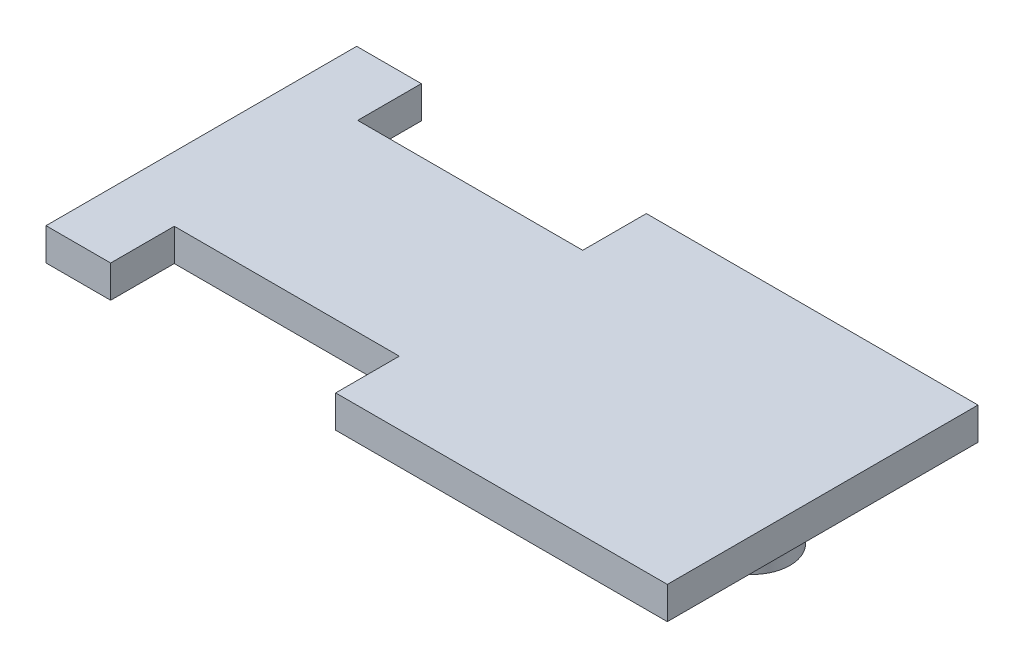
ISO-10303-21;
HEADER;
FILE_DESCRIPTION(('STEP AP214'),'2;1');
FILE_NAME('part.step','',(''),(''),'','','');
FILE_SCHEMA(('AUTOMOTIVE_DESIGN { 1 0 10303 214 1 1 1 1 }'));
ENDSEC;
DATA;
#1=APPLICATION_CONTEXT('core data for automotive mechanical design processes');
#2=APPLICATION_PROTOCOL_DEFINITION('international standard','automotive_design',2000,#1);
#3=PRODUCT_CONTEXT('',#1,'mechanical');
#4=PRODUCT('Part','Part','',(#3));
#5=PRODUCT_RELATED_PRODUCT_CATEGORY('part','',(#4));
#6=PRODUCT_DEFINITION_FORMATION('','',#4);
#7=PRODUCT_DEFINITION_CONTEXT('part definition',#1,'design');
#8=PRODUCT_DEFINITION('design','',#6,#7);
#9=PRODUCT_DEFINITION_SHAPE('','',#8);
#10=(LENGTH_UNIT() NAMED_UNIT(*) SI_UNIT(.MILLI.,.METRE.));
#11=(NAMED_UNIT(*) PLANE_ANGLE_UNIT() SI_UNIT($,.RADIAN.));
#12=(NAMED_UNIT(*) SI_UNIT($,.STERADIAN.) SOLID_ANGLE_UNIT());
#13=UNCERTAINTY_MEASURE_WITH_UNIT(LENGTH_MEASURE(1.E-05),#10,'distance_accuracy_value','');
#14=(GEOMETRIC_REPRESENTATION_CONTEXT(3) GLOBAL_UNCERTAINTY_ASSIGNED_CONTEXT((#13)) GLOBAL_UNIT_ASSIGNED_CONTEXT((#10,
#11,#12)) REPRESENTATION_CONTEXT('',''));
#15=CARTESIAN_POINT('',(0.,0.,0.));
#16=DIRECTION('',(0.,0.,1.));
#17=DIRECTION('',(1.,0.,0.));
#18=AXIS2_PLACEMENT_3D('',#15,#16,#17);
#19=CARTESIAN_POINT('',(-103.716666666667,10.,-55.6947916666667));
#20=DIRECTION('',(0.,0.,1.));
#21=DIRECTION('',(1.,0.,0.));
#22=AXIS2_PLACEMENT_3D('',#19,#20,#21);
#23=PLANE('',#22);
#24=DIRECTION('',(0.,-1.,0.));
#25=VECTOR('',#24,1.);
#26=CARTESIAN_POINT('',(-103.716666666667,10.,-55.6947916666667));
#27=LINE('',#26,#25);
#28=CARTESIAN_POINT('',(-103.716666666667,5.284,-55.6947916666667));
#29=VERTEX_POINT('',#28);
#30=CARTESIAN_POINT('',(-103.716666666667,0.,-55.6947916666667));
#31=VERTEX_POINT('',#30);
#32=EDGE_CURVE('E212',#29,#31,#27,.T.);
#33=ORIENTED_EDGE('',*,*,#32,.F.);
#34=DIRECTION('',(1.,0.,0.));
#35=VECTOR('',#34,1.);
#36=CARTESIAN_POINT('',(-103.716666666667,5.284,-55.6947916666667));
#37=LINE('',#36,#35);
#38=CARTESIAN_POINT('',(-93.1444325775468,5.284,-55.6947916666667));
#39=VERTEX_POINT('',#38);
#40=EDGE_CURVE('E266',#29,#39,#37,.T.);
#41=ORIENTED_EDGE('',*,*,#40,.T.);
#42=DIRECTION('',(0.,1.,0.));
#43=VECTOR('',#42,1.);
#44=CARTESIAN_POINT('',(-93.1444325775468,10.,-55.6947916666667));
#45=LINE('',#44,#43);
#46=CARTESIAN_POINT('',(-93.1444325775468,0.,-55.6947916666667));
#47=VERTEX_POINT('',#46);
#48=EDGE_CURVE('E184',#47,#39,#45,.T.);
#49=ORIENTED_EDGE('',*,*,#48,.F.);
#50=DIRECTION('',(-1.,0.,0.));
#51=VECTOR('',#50,1.);
#52=CARTESIAN_POINT('',(-103.716666666667,0.,-55.6947916666667));
#53=LINE('',#52,#51);
#54=EDGE_CURVE('E192',#47,#31,#53,.T.);
#55=ORIENTED_EDGE('',*,*,#54,.T.);
#56=EDGE_LOOP('',(#33,#41,#49,#55));
#57=FACE_BOUND('',#56,.T.);
#58=ADVANCED_FACE('F42',(#57),#23,.F.);
#59=CARTESIAN_POINT('',(-103.716666666667,10.,-4.89479166666667));
#60=DIRECTION('',(0.,0.,-1.));
#61=DIRECTION('',(-1.,0.,0.));
#62=AXIS2_PLACEMENT_3D('',#59,#60,#61);
#63=PLANE('',#62);
#64=DIRECTION('',(0.,-1.,0.));
#65=VECTOR('',#64,1.);
#66=CARTESIAN_POINT('',(-2.11666666666666,10.,-4.89479166666667));
#67=LINE('',#66,#65);
#68=CARTESIAN_POINT('',(-2.11666666666667,5.284,-4.89479166666667));
#69=VERTEX_POINT('',#68);
#70=CARTESIAN_POINT('',(-2.11666666666666,0.,-4.89479166666667));
#71=VERTEX_POINT('',#70);
#72=EDGE_CURVE('E206',#69,#71,#67,.T.);
#73=ORIENTED_EDGE('',*,*,#72,.F.);
#74=DIRECTION('',(-1.,0.,0.));
#75=VECTOR('',#74,1.);
#76=CARTESIAN_POINT('',(-103.716666666667,5.284,-4.89479166666667));
#77=LINE('',#76,#75);
#78=CARTESIAN_POINT('',(-56.3484616639288,5.284,-4.89479166666667));
#79=VERTEX_POINT('',#78);
#80=EDGE_CURVE('E263',#69,#79,#77,.T.);
#81=ORIENTED_EDGE('',*,*,#80,.T.);
#82=DIRECTION('',(0.,1.,0.));
#83=VECTOR('',#82,1.);
#84=CARTESIAN_POINT('',(-56.3484616639288,0.,-4.89479166666667));
#85=LINE('',#84,#83);
#86=CARTESIAN_POINT('',(-56.3484616639288,0.,-4.89479166666667));
#87=VERTEX_POINT('',#86);
#88=EDGE_CURVE('E142',#87,#79,#85,.T.);
#89=ORIENTED_EDGE('',*,*,#88,.F.);
#90=DIRECTION('',(1.,0.,0.));
#91=VECTOR('',#90,1.);
#92=CARTESIAN_POINT('',(-103.716666666667,0.,-4.89479166666667));
#93=LINE('',#92,#91);
#94=EDGE_CURVE('E201',#87,#71,#93,.T.);
#95=ORIENTED_EDGE('',*,*,#94,.T.);
#96=EDGE_LOOP('',(#73,#81,#89,#95));
#97=FACE_BOUND('',#96,.T.);
#98=ADVANCED_FACE('F262',(#97),#63,.F.);
#99=CARTESIAN_POINT('',(0.,0.,0.));
#100=DIRECTION('',(0.,1.,0.));
#101=DIRECTION('',(0.,0.,1.));
#102=AXIS2_PLACEMENT_3D('',#99,#100,#101);
#103=PLANE('',#102);
#104=CARTESIAN_POINT('',(-13.6315565441863,0.,-30.2947916666667));
#105=DIRECTION('',(0.,1.,0.));
#106=DIRECTION('',(0.,0.,1.));
#107=AXIS2_PLACEMENT_3D('',#104,#105,#106);
#108=CIRCLE('',#107,6.16992284667772);
#109=CARTESIAN_POINT('',(-13.6315565441863,0.,-24.124868819989));
#110=VERTEX_POINT('',#109);
#111=EDGE_CURVE('E51',#110,#110,#108,.F.);
#112=ORIENTED_EDGE('',*,*,#111,.F.);
#113=EDGE_LOOP('',(#112));
#114=FACE_BOUND('',#113,.T.);
#115=DIRECTION('',(0.,0.,1.));
#116=VECTOR('',#115,1.);
#117=CARTESIAN_POINT('',(-56.3484616639288,0.,0.));
#118=LINE('',#117,#116);
#119=CARTESIAN_POINT('',(-56.3484616639288,0.,-15.3005443271972));
#120=VERTEX_POINT('',#119);
#121=EDGE_CURVE('E179',#120,#87,#118,.T.);
#122=ORIENTED_EDGE('',*,*,#121,.F.);
#123=DIRECTION('',(1.,0.,0.));
#124=VECTOR('',#123,1.);
#125=CARTESIAN_POINT('',(0.,0.,-15.3005443271972));
#126=LINE('',#125,#124);
#127=CARTESIAN_POINT('',(-93.1444325775468,0.,-15.3005443271972));
#128=VERTEX_POINT('',#127);
#129=EDGE_CURVE('E148',#128,#120,#126,.T.);
#130=ORIENTED_EDGE('',*,*,#129,.F.);
#131=DIRECTION('',(0.,0.,1.));
#132=VECTOR('',#131,1.);
#133=CARTESIAN_POINT('',(-93.1444325775468,0.,0.));
#134=LINE('',#133,#132);
#135=CARTESIAN_POINT('',(-93.1444325775468,0.,-4.89479166666667));
#136=VERTEX_POINT('',#135);
#137=EDGE_CURVE('E65',#128,#136,#134,.T.);
#138=ORIENTED_EDGE('',*,*,#137,.T.);
#139=CARTESIAN_POINT('',(-103.716666666667,0.,-4.89479166666667));
#140=VERTEX_POINT('',#139);
#141=EDGE_CURVE('E202',#140,#136,#93,.T.);
#142=ORIENTED_EDGE('',*,*,#141,.F.);
#143=DIRECTION('',(0.,0.,1.));
#144=VECTOR('',#143,1.);
#145=CARTESIAN_POINT('',(-103.716666666667,0.,-55.6947916666667));
#146=LINE('',#145,#144);
#147=EDGE_CURVE('E197',#31,#140,#146,.T.);
#148=ORIENTED_EDGE('',*,*,#147,.F.);
#149=ORIENTED_EDGE('',*,*,#54,.F.);
#150=DIRECTION('',(0.,0.,-1.));
#151=VECTOR('',#150,1.);
#152=CARTESIAN_POINT('',(-93.1444325775468,0.,-45.2890390061361));
#153=LINE('',#152,#151);
#154=CARTESIAN_POINT('',(-93.1444325775468,0.,-45.2890390061361));
#155=VERTEX_POINT('',#154);
#156=EDGE_CURVE('E176',#155,#47,#153,.T.);
#157=ORIENTED_EDGE('',*,*,#156,.F.);
#158=DIRECTION('',(1.,0.,0.));
#159=VECTOR('',#158,1.);
#160=CARTESIAN_POINT('',(-93.1444325775468,0.,-45.2890390061361));
#161=LINE('',#160,#159);
#162=CARTESIAN_POINT('',(-56.3484616639288,0.,-45.2890390061361));
#163=VERTEX_POINT('',#162);
#164=EDGE_CURVE('E168',#155,#163,#161,.T.);
#165=ORIENTED_EDGE('',*,*,#164,.T.);
#166=DIRECTION('',(0.,0.,-1.));
#167=VECTOR('',#166,1.);
#168=CARTESIAN_POINT('',(-56.3484616639288,0.,-45.2890390061361));
#169=LINE('',#168,#167);
#170=CARTESIAN_POINT('',(-56.3484616639288,0.,-55.6947916666667));
#171=VERTEX_POINT('',#170);
#172=EDGE_CURVE('E172',#163,#171,#169,.T.);
#173=ORIENTED_EDGE('',*,*,#172,.T.);
#174=CARTESIAN_POINT('',(-2.11666666666666,0.,-55.6947916666667));
#175=VERTEX_POINT('',#174);
#176=EDGE_CURVE('E193',#175,#171,#53,.T.);
#177=ORIENTED_EDGE('',*,*,#176,.F.);
#178=DIRECTION('',(0.,0.,-1.));
#179=VECTOR('',#178,1.);
#180=CARTESIAN_POINT('',(-2.11666666666666,0.,-55.6947916666667));
#181=LINE('',#180,#179);
#182=EDGE_CURVE('E188',#71,#175,#181,.T.);
#183=ORIENTED_EDGE('',*,*,#182,.F.);
#184=ORIENTED_EDGE('',*,*,#94,.F.);
#185=EDGE_LOOP('',(#122,#130,#138,#142,#148,#149,#157,#165,#173,#177,#183,#184));
#186=FACE_BOUND('',#185,.T.);
#187=ADVANCED_FACE('F255',(#114,#186),#103,.F.);
#188=CARTESIAN_POINT('',(-2.11666666666666,10.,-55.6947916666667));
#189=DIRECTION('',(-1.,0.,0.));
#190=DIRECTION('',(0.,0.,1.));
#191=AXIS2_PLACEMENT_3D('',#188,#189,#190);
#192=PLANE('',#191);
#193=DIRECTION('',(0.,-1.,0.));
#194=VECTOR('',#193,1.);
#195=CARTESIAN_POINT('',(-2.11666666666666,10.,-55.6947916666667));
#196=LINE('',#195,#194);
#197=CARTESIAN_POINT('',(-2.11666666666666,5.284,-55.6947916666667));
#198=VERTEX_POINT('',#197);
#199=EDGE_CURVE('E215',#198,#175,#196,.T.);
#200=ORIENTED_EDGE('',*,*,#199,.F.);
#201=DIRECTION('',(0.,0.,1.));
#202=VECTOR('',#201,1.);
#203=CARTESIAN_POINT('',(-2.11666666666666,5.284,-55.6947916666667));
#204=LINE('',#203,#202);
#205=EDGE_CURVE('E280',#198,#69,#204,.T.);
#206=ORIENTED_EDGE('',*,*,#205,.T.);
#207=ORIENTED_EDGE('',*,*,#72,.T.);
#208=ORIENTED_EDGE('',*,*,#182,.T.);
#209=EDGE_LOOP('',(#200,#206,#207,#208));
#210=FACE_BOUND('',#209,.T.);
#211=ADVANCED_FACE('F44',(#210),#192,.F.);
#212=DIRECTION('',(0.,1.,0.));
#213=VECTOR('',#212,1.);
#214=CARTESIAN_POINT('',(-56.3484616639288,10.,-55.6947916666667));
#215=LINE('',#214,#213);
#216=CARTESIAN_POINT('',(-56.3484616639288,5.284,-55.6947916666667));
#217=VERTEX_POINT('',#216);
#218=EDGE_CURVE('E180',#171,#217,#215,.T.);
#219=ORIENTED_EDGE('',*,*,#218,.T.);
#220=DIRECTION('',(1.,0.,0.));
#221=VECTOR('',#220,1.);
#222=CARTESIAN_POINT('',(-103.716666666667,5.284,-55.6947916666667));
#223=LINE('',#222,#221);
#224=EDGE_CURVE('E223',#217,#198,#223,.T.);
#225=ORIENTED_EDGE('',*,*,#224,.T.);
#226=ORIENTED_EDGE('',*,*,#199,.T.);
#227=ORIENTED_EDGE('',*,*,#176,.T.);
#228=EDGE_LOOP('',(#219,#225,#226,#227));
#229=FACE_BOUND('',#228,.T.);
#230=ADVANCED_FACE('F293',(#229),#23,.F.);
#231=CARTESIAN_POINT('',(-103.716666666667,10.,-55.6947916666667));
#232=DIRECTION('',(1.,0.,0.));
#233=DIRECTION('',(0.,0.,-1.));
#234=AXIS2_PLACEMENT_3D('',#231,#232,#233);
#235=PLANE('',#234);
#236=DIRECTION('',(0.,-1.,0.));
#237=VECTOR('',#236,1.);
#238=CARTESIAN_POINT('',(-103.716666666667,10.,-4.89479166666667));
#239=LINE('',#238,#237);
#240=CARTESIAN_POINT('',(-103.716666666667,5.284,-4.89479166666667));
#241=VERTEX_POINT('',#240);
#242=EDGE_CURVE('E209',#241,#140,#239,.T.);
#243=ORIENTED_EDGE('',*,*,#242,.F.);
#244=DIRECTION('',(0.,0.,-1.));
#245=VECTOR('',#244,1.);
#246=CARTESIAN_POINT('',(-103.716666666667,5.284,-55.6947916666667));
#247=LINE('',#246,#245);
#248=EDGE_CURVE('E267',#241,#29,#247,.T.);
#249=ORIENTED_EDGE('',*,*,#248,.T.);
#250=ORIENTED_EDGE('',*,*,#32,.T.);
#251=ORIENTED_EDGE('',*,*,#147,.T.);
#252=EDGE_LOOP('',(#243,#249,#250,#251));
#253=FACE_BOUND('',#252,.T.);
#254=ADVANCED_FACE('F300',(#253),#235,.F.);
#255=DIRECTION('',(0.,1.,0.));
#256=VECTOR('',#255,1.);
#257=CARTESIAN_POINT('',(-93.1444325775468,0.,-4.89479166666667));
#258=LINE('',#257,#256);
#259=CARTESIAN_POINT('',(-93.1444325775468,5.284,-4.89479166666667));
#260=VERTEX_POINT('',#259);
#261=EDGE_CURVE('E154',#136,#260,#258,.T.);
#262=ORIENTED_EDGE('',*,*,#261,.T.);
#263=DIRECTION('',(-1.,0.,0.));
#264=VECTOR('',#263,1.);
#265=CARTESIAN_POINT('',(-103.716666666667,5.284,-4.89479166666667));
#266=LINE('',#265,#264);
#267=EDGE_CURVE('E144',#260,#241,#266,.T.);
#268=ORIENTED_EDGE('',*,*,#267,.T.);
#269=ORIENTED_EDGE('',*,*,#242,.T.);
#270=ORIENTED_EDGE('',*,*,#141,.T.);
#271=EDGE_LOOP('',(#262,#268,#269,#270));
#272=FACE_BOUND('',#271,.T.);
#273=ADVANCED_FACE('F250',(#272),#63,.F.);
#274=CARTESIAN_POINT('',(-93.1444325775468,0.,-45.2890390061361));
#275=DIRECTION('',(1.,0.,0.));
#276=DIRECTION('',(0.,0.,-1.));
#277=AXIS2_PLACEMENT_3D('',#274,#275,#276);
#278=PLANE('',#277);
#279=DIRECTION('',(0.,0.,-1.));
#280=VECTOR('',#279,1.);
#281=CARTESIAN_POINT('',(-93.1444325775468,5.284,-45.2890390061361));
#282=LINE('',#281,#280);
#283=CARTESIAN_POINT('',(-93.1444325775468,5.284,-45.2890390061361));
#284=VERTEX_POINT('',#283);
#285=EDGE_CURVE('E272',#284,#39,#282,.T.);
#286=ORIENTED_EDGE('',*,*,#285,.F.);
#287=DIRECTION('',(0.,1.,0.));
#288=VECTOR('',#287,1.);
#289=CARTESIAN_POINT('',(-93.1444325775468,0.,-45.2890390061361));
#290=LINE('',#289,#288);
#291=EDGE_CURVE('E163',#155,#284,#290,.T.);
#292=ORIENTED_EDGE('',*,*,#291,.F.);
#293=ORIENTED_EDGE('',*,*,#156,.T.);
#294=ORIENTED_EDGE('',*,*,#48,.T.);
#295=EDGE_LOOP('',(#286,#292,#293,#294));
#296=FACE_BOUND('',#295,.T.);
#297=ADVANCED_FACE('F315',(#296),#278,.T.);
#298=CARTESIAN_POINT('',(-56.3484616639288,0.,-45.2890390061361));
#299=DIRECTION('',(1.,0.,0.));
#300=DIRECTION('',(0.,0.,-1.));
#301=AXIS2_PLACEMENT_3D('',#298,#299,#300);
#302=PLANE('',#301);
#303=DIRECTION('',(0.,1.,0.));
#304=VECTOR('',#303,1.);
#305=CARTESIAN_POINT('',(-56.3484616639288,0.,-45.2890390061361));
#306=LINE('',#305,#304);
#307=CARTESIAN_POINT('',(-56.3484616639288,5.284,-45.2890390061361));
#308=VERTEX_POINT('',#307);
#309=EDGE_CURVE('E159',#163,#308,#306,.T.);
#310=ORIENTED_EDGE('',*,*,#309,.T.);
#311=DIRECTION('',(0.,0.,-1.));
#312=VECTOR('',#311,1.);
#313=CARTESIAN_POINT('',(-56.3484616639288,5.284,-45.2890390061361));
#314=LINE('',#313,#312);
#315=EDGE_CURVE('E231',#308,#217,#314,.T.);
#316=ORIENTED_EDGE('',*,*,#315,.T.);
#317=ORIENTED_EDGE('',*,*,#218,.F.);
#318=ORIENTED_EDGE('',*,*,#172,.F.);
#319=EDGE_LOOP('',(#310,#316,#317,#318));
#320=FACE_BOUND('',#319,.T.);
#321=ADVANCED_FACE('F290',(#320),#302,.F.);
#322=CARTESIAN_POINT('',(-93.1444325775468,0.,-45.2890390061361));
#323=DIRECTION('',(0.,0.,1.));
#324=DIRECTION('',(1.,0.,0.));
#325=AXIS2_PLACEMENT_3D('',#322,#323,#324);
#326=PLANE('',#325);
#327=ORIENTED_EDGE('',*,*,#291,.T.);
#328=DIRECTION('',(1.,0.,0.));
#329=VECTOR('',#328,1.);
#330=CARTESIAN_POINT('',(-93.1444325775468,5.284,-45.2890390061361));
#331=LINE('',#330,#329);
#332=EDGE_CURVE('E237',#284,#308,#331,.T.);
#333=ORIENTED_EDGE('',*,*,#332,.T.);
#334=ORIENTED_EDGE('',*,*,#309,.F.);
#335=ORIENTED_EDGE('',*,*,#164,.F.);
#336=EDGE_LOOP('',(#327,#333,#334,#335));
#337=FACE_BOUND('',#336,.T.);
#338=ADVANCED_FACE('F286',(#337),#326,.F.);
#339=CARTESIAN_POINT('',(-56.3484616639288,0.,0.));
#340=DIRECTION('',(-1.,0.,0.));
#341=DIRECTION('',(0.,0.,1.));
#342=AXIS2_PLACEMENT_3D('',#339,#340,#341);
#343=PLANE('',#342);
#344=DIRECTION('',(0.,0.,1.));
#345=VECTOR('',#344,1.);
#346=CARTESIAN_POINT('',(-56.3484616639288,5.284,0.));
#347=LINE('',#346,#345);
#348=CARTESIAN_POINT('',(-56.3484616639288,5.284,-15.3005443271972));
#349=VERTEX_POINT('',#348);
#350=EDGE_CURVE('E131',#349,#79,#347,.T.);
#351=ORIENTED_EDGE('',*,*,#350,.F.);
#352=DIRECTION('',(0.,1.,0.));
#353=VECTOR('',#352,1.);
#354=CARTESIAN_POINT('',(-56.3484616639288,0.,-15.3005443271972));
#355=LINE('',#354,#353);
#356=EDGE_CURVE('E139',#120,#349,#355,.T.);
#357=ORIENTED_EDGE('',*,*,#356,.F.);
#358=ORIENTED_EDGE('',*,*,#121,.T.);
#359=ORIENTED_EDGE('',*,*,#88,.T.);
#360=EDGE_LOOP('',(#351,#357,#358,#359));
#361=FACE_BOUND('',#360,.T.);
#362=ADVANCED_FACE('F138',(#361),#343,.T.);
#363=CARTESIAN_POINT('',(-93.1444325775468,0.,0.));
#364=DIRECTION('',(-1.,0.,0.));
#365=DIRECTION('',(0.,0.,1.));
#366=AXIS2_PLACEMENT_3D('',#363,#364,#365);
#367=PLANE('',#366);
#368=DIRECTION('',(0.,1.,0.));
#369=VECTOR('',#368,1.);
#370=CARTESIAN_POINT('',(-93.1444325775468,0.,-15.3005443271972));
#371=LINE('',#370,#369);
#372=CARTESIAN_POINT('',(-93.1444325775468,5.284,-15.3005443271972));
#373=VERTEX_POINT('',#372);
#374=EDGE_CURVE('E150',#128,#373,#371,.T.);
#375=ORIENTED_EDGE('',*,*,#374,.T.);
#376=DIRECTION('',(0.,0.,1.));
#377=VECTOR('',#376,1.);
#378=CARTESIAN_POINT('',(-93.1444325775468,5.284,0.));
#379=LINE('',#378,#377);
#380=EDGE_CURVE('E57',#373,#260,#379,.T.);
#381=ORIENTED_EDGE('',*,*,#380,.T.);
#382=ORIENTED_EDGE('',*,*,#261,.F.);
#383=ORIENTED_EDGE('',*,*,#137,.F.);
#384=EDGE_LOOP('',(#375,#381,#382,#383));
#385=FACE_BOUND('',#384,.T.);
#386=ADVANCED_FACE('F253',(#385),#367,.F.);
#387=CARTESIAN_POINT('',(0.,0.,-15.3005443271972));
#388=DIRECTION('',(0.,0.,1.));
#389=DIRECTION('',(1.,0.,0.));
#390=AXIS2_PLACEMENT_3D('',#387,#388,#389);
#391=PLANE('',#390);
#392=DIRECTION('',(1.,0.,0.));
#393=VECTOR('',#392,1.);
#394=CARTESIAN_POINT('',(0.,5.284,-15.3005443271972));
#395=LINE('',#394,#393);
#396=EDGE_CURVE('E11',#373,#349,#395,.T.);
#397=ORIENTED_EDGE('',*,*,#396,.F.);
#398=ORIENTED_EDGE('',*,*,#374,.F.);
#399=ORIENTED_EDGE('',*,*,#129,.T.);
#400=ORIENTED_EDGE('',*,*,#356,.T.);
#401=EDGE_LOOP('',(#397,#398,#399,#400));
#402=FACE_BOUND('',#401,.T.);
#403=ADVANCED_FACE('F146',(#402),#391,.T.);
#404=CARTESIAN_POINT('',(-13.6315565441863,-7.41246018807505,-30.2947916666667));
#405=DIRECTION('',(0.,1.,0.));
#406=DIRECTION('',(0.,0.,1.));
#407=AXIS2_PLACEMENT_3D('',#404,#405,#406);
#408=CYLINDRICAL_SURFACE('',#407,6.16992284667772);
#409=CARTESIAN_POINT('',(-13.6315565441863,-7.41246018807505,-30.2947916666667));
#410=DIRECTION('',(0.,-1.,0.));
#411=DIRECTION('',(0.,0.,-1.));
#412=AXIS2_PLACEMENT_3D('',#409,#410,#411);
#413=CIRCLE('',#412,6.16992284667772);
#414=CARTESIAN_POINT('',(-13.6315565441863,-7.41246018807505,-36.4647145133444));
#415=VERTEX_POINT('',#414);
#416=EDGE_CURVE('E164',#415,#415,#413,.T.);
#417=ORIENTED_EDGE('',*,*,#416,.F.);
#418=EDGE_LOOP('',(#417));
#419=FACE_BOUND('',#418,.T.);
#420=ORIENTED_EDGE('',*,*,#111,.T.);
#421=EDGE_LOOP('',(#420));
#422=FACE_BOUND('',#421,.T.);
#423=ADVANCED_FACE('F328',(#419,#422),#408,.T.);
#424=CARTESIAN_POINT('',(0.,-7.41246018807505,0.));
#425=DIRECTION('',(0.,-1.,0.));
#426=DIRECTION('',(0.,0.,-1.));
#427=AXIS2_PLACEMENT_3D('',#424,#425,#426);
#428=PLANE('',#427);
#429=CARTESIAN_POINT('',(-13.4151096564591,-7.41246018807505,-30.457126832462));
#430=DIRECTION('',(0.,-1.,0.));
#431=DIRECTION('',(0.,0.,-1.));
#432=AXIS2_PLACEMENT_3D('',#429,#430,#431);
#433=CIRCLE('',#432,3.511846584517);
#434=CARTESIAN_POINT('',(-13.4151096564591,-7.41246018807505,-33.968973416979));
#435=VERTEX_POINT('',#434);
#436=EDGE_CURVE('E220',#435,#435,#433,.F.);
#437=ORIENTED_EDGE('',*,*,#436,.T.);
#438=EDGE_LOOP('',(#437));
#439=FACE_BOUND('',#438,.T.);
#440=ORIENTED_EDGE('',*,*,#416,.T.);
#441=EDGE_LOOP('',(#440));
#442=FACE_BOUND('',#441,.T.);
#443=ADVANCED_FACE('F333',(#439,#442),#428,.T.);
#444=CARTESIAN_POINT('',(-13.4151096564591,-7.41246018807505,-30.457126832462));
#445=DIRECTION('',(-0.554700196225226,0.,0.832050294337845));
#446=DIRECTION('',(0.832050294337845,0.,0.554700196225226));
#447=AXIS2_PLACEMENT_3D('',#444,#445,#446);
#448=SPHERICAL_SURFACE('',#447,3.511846584517);
#449=CARTESIAN_POINT('',(-13.4151096564591,-7.41246018807505,-30.457126832462));
#450=DIRECTION('',(0.,-1.,0.));
#451=DIRECTION('',(0.,0.,-1.));
#452=AXIS2_PLACEMENT_3D('',#449,#450,#451);
#453=SPHERICAL_SURFACE('',#452,3.511846584517);
#454=ORIENTED_EDGE('',*,*,#436,.F.);
#455=EDGE_LOOP('',(#454));
#456=FACE_BOUND('',#455,.T.);
#457=ADVANCED_FACE('F337',(#456),#453,.T.);
#458=CARTESIAN_POINT('',(0.,5.284,0.));
#459=DIRECTION('',(0.,-1.,0.));
#460=DIRECTION('',(0.,0.,-1.));
#461=AXIS2_PLACEMENT_3D('',#458,#459,#460);
#462=PLANE('',#461);
#463=ORIENTED_EDGE('',*,*,#315,.F.);
#464=ORIENTED_EDGE('',*,*,#332,.F.);
#465=ORIENTED_EDGE('',*,*,#285,.T.);
#466=ORIENTED_EDGE('',*,*,#40,.F.);
#467=ORIENTED_EDGE('',*,*,#248,.F.);
#468=ORIENTED_EDGE('',*,*,#267,.F.);
#469=ORIENTED_EDGE('',*,*,#380,.F.);
#470=ORIENTED_EDGE('',*,*,#396,.T.);
#471=ORIENTED_EDGE('',*,*,#350,.T.);
#472=ORIENTED_EDGE('',*,*,#80,.F.);
#473=ORIENTED_EDGE('',*,*,#205,.F.);
#474=ORIENTED_EDGE('',*,*,#224,.F.);
#475=EDGE_LOOP('',(#463,#464,#465,#466,#467,#468,#469,#470,#471,#472,#473,#474));
#476=FACE_BOUND('',#475,.T.);
#477=ADVANCED_FACE('F130',(#476),#462,.F.);
#478=CLOSED_SHELL('',(#58,#98,#187,#211,#230,#254,#273,#297,#321,#338,#362,#386,#403,#423,#443,
#457,#477));
#479=MANIFOLD_SOLID_BREP('B2',#478);
#480=ADVANCED_BREP_SHAPE_REPRESENTATION('',(#18,#479),#14);
#481=SHAPE_DEFINITION_REPRESENTATION(#9,#480);
ENDSEC;
END-ISO-10303-21;
